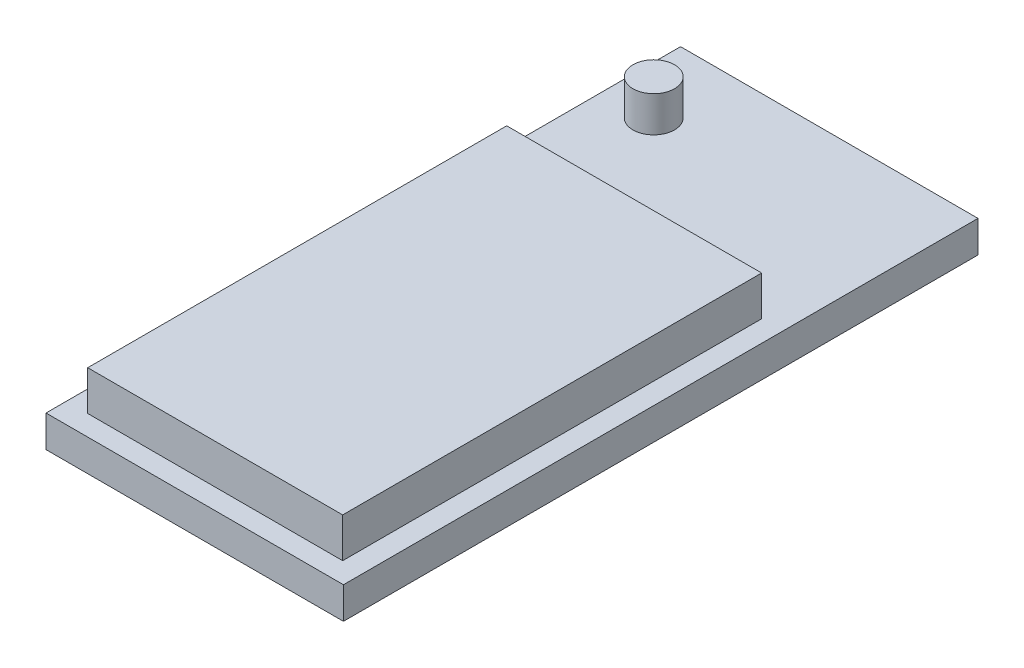
ISO-10303-21;
HEADER;
FILE_DESCRIPTION(('STEP AP214'),'2;1');
FILE_NAME('part.step','',(''),(''),'','','');
FILE_SCHEMA(('AUTOMOTIVE_DESIGN { 1 0 10303 214 1 1 1 1 }'));
ENDSEC;
DATA;
#1=APPLICATION_CONTEXT('core data for automotive mechanical design processes');
#2=APPLICATION_PROTOCOL_DEFINITION('international standard','automotive_design',2000,#1);
#3=PRODUCT_CONTEXT('',#1,'mechanical');
#4=PRODUCT('Part','Part','',(#3));
#5=PRODUCT_RELATED_PRODUCT_CATEGORY('part','',(#4));
#6=PRODUCT_DEFINITION_FORMATION('','',#4);
#7=PRODUCT_DEFINITION_CONTEXT('part definition',#1,'design');
#8=PRODUCT_DEFINITION('design','',#6,#7);
#9=PRODUCT_DEFINITION_SHAPE('','',#8);
#10=(LENGTH_UNIT() NAMED_UNIT(*) SI_UNIT(.MILLI.,.METRE.));
#11=(NAMED_UNIT(*) PLANE_ANGLE_UNIT() SI_UNIT($,.RADIAN.));
#12=(NAMED_UNIT(*) SI_UNIT($,.STERADIAN.) SOLID_ANGLE_UNIT());
#13=UNCERTAINTY_MEASURE_WITH_UNIT(LENGTH_MEASURE(1.E-05),#10,'distance_accuracy_value','');
#14=(GEOMETRIC_REPRESENTATION_CONTEXT(3) GLOBAL_UNCERTAINTY_ASSIGNED_CONTEXT((#13)) GLOBAL_UNIT_ASSIGNED_CONTEXT((#10,
#11,#12)) REPRESENTATION_CONTEXT('',''));
#15=CARTESIAN_POINT('',(0.,0.,0.));
#16=DIRECTION('',(0.,0.,1.));
#17=DIRECTION('',(1.,0.,0.));
#18=AXIS2_PLACEMENT_3D('',#15,#16,#17);
#19=CARTESIAN_POINT('',(0.,1.6,0.));
#20=DIRECTION('',(0.,1.,0.));
#21=DIRECTION('',(0.,0.,1.));
#22=AXIS2_PLACEMENT_3D('',#19,#20,#21);
#23=PLANE('',#22);
#24=DIRECTION('',(-1.,0.,0.));
#25=VECTOR('',#24,1.);
#26=CARTESIAN_POINT('',(6.43061488700591,1.6,-6.15881063183125));
#27=LINE('',#26,#25);
#28=CARTESIAN_POINT('',(6.43061488700591,1.6,-6.15881063183125));
#29=VERTEX_POINT('',#28);
#30=CARTESIAN_POINT('',(-6.42646424221845,1.6,-6.15881063183125));
#31=VERTEX_POINT('',#30);
#32=EDGE_CURVE('E213',#29,#31,#27,.T.);
#33=ORIENTED_EDGE('',*,*,#32,.F.);
#34=DIRECTION('',(0.,0.,-1.));
#35=VECTOR('',#34,1.);
#36=CARTESIAN_POINT('',(6.43061488700591,1.6,14.9699557693416));
#37=LINE('',#36,#35);
#38=CARTESIAN_POINT('',(6.43061488700591,1.6,14.9699557693416));
#39=VERTEX_POINT('',#38);
#40=EDGE_CURVE('E132',#39,#29,#37,.T.);
#41=ORIENTED_EDGE('',*,*,#40,.F.);
#42=DIRECTION('',(1.,0.,0.));
#43=VECTOR('',#42,1.);
#44=CARTESIAN_POINT('',(6.43061488700591,1.6,14.9699557693416));
#45=LINE('',#44,#43);
#46=CARTESIAN_POINT('',(-6.42646424221845,1.6,14.9699557693416));
#47=VERTEX_POINT('',#46);
#48=EDGE_CURVE('E128',#47,#39,#45,.T.);
#49=ORIENTED_EDGE('',*,*,#48,.F.);
#50=DIRECTION('',(0.,0.,1.));
#51=VECTOR('',#50,1.);
#52=CARTESIAN_POINT('',(-6.42646424221845,1.6,14.9699557693416));
#53=LINE('',#52,#51);
#54=EDGE_CURVE('E222',#31,#47,#53,.T.);
#55=ORIENTED_EDGE('',*,*,#54,.F.);
#56=EDGE_LOOP('',(#33,#41,#49,#55));
#57=FACE_BOUND('',#56,.T.);
#58=DIRECTION('',(0.,0.,1.));
#59=VECTOR('',#58,1.);
#60=CARTESIAN_POINT('',(-7.5,1.6,-16.));
#61=LINE('',#60,#59);
#62=CARTESIAN_POINT('',(-7.5,1.6,-16.));
#63=VERTEX_POINT('',#62);
#64=CARTESIAN_POINT('',(-7.5,1.6,16.));
#65=VERTEX_POINT('',#64);
#66=EDGE_CURVE('E142',#63,#65,#61,.T.);
#67=ORIENTED_EDGE('',*,*,#66,.T.);
#68=DIRECTION('',(1.,0.,0.));
#69=VECTOR('',#68,1.);
#70=CARTESIAN_POINT('',(-7.5,1.6,16.));
#71=LINE('',#70,#69);
#72=CARTESIAN_POINT('',(7.50000000000001,1.6,16.));
#73=VERTEX_POINT('',#72);
#74=EDGE_CURVE('E87',#65,#73,#71,.T.);
#75=ORIENTED_EDGE('',*,*,#74,.T.);
#76=DIRECTION('',(0.,0.,-1.));
#77=VECTOR('',#76,1.);
#78=CARTESIAN_POINT('',(7.5,1.6,-16.));
#79=LINE('',#78,#77);
#80=CARTESIAN_POINT('',(7.5,1.6,-16.));
#81=VERTEX_POINT('',#80);
#82=EDGE_CURVE('E145',#73,#81,#79,.T.);
#83=ORIENTED_EDGE('',*,*,#82,.T.);
#84=DIRECTION('',(-1.,0.,0.));
#85=VECTOR('',#84,1.);
#86=CARTESIAN_POINT('',(-7.5,1.6,-16.));
#87=LINE('',#86,#85);
#88=EDGE_CURVE('E59',#81,#63,#87,.T.);
#89=ORIENTED_EDGE('',*,*,#88,.T.);
#90=EDGE_LOOP('',(#67,#75,#83,#89));
#91=FACE_BOUND('',#90,.T.);
#92=CARTESIAN_POINT('',(-5.06278392747851,1.6,-12.2099844827937));
#93=DIRECTION('',(0.,1.,0.));
#94=DIRECTION('',(0.,0.,1.));
#95=AXIS2_PLACEMENT_3D('',#92,#93,#94);
#96=CIRCLE('',#95,1.04874698155847);
#97=CARTESIAN_POINT('',(-5.06278392747851,1.6,-11.1612375012352));
#98=VERTEX_POINT('',#97);
#99=EDGE_CURVE('E211',#98,#98,#96,.T.);
#100=ORIENTED_EDGE('',*,*,#99,.F.);
#101=EDGE_LOOP('',(#100));
#102=FACE_BOUND('',#101,.T.);
#103=ADVANCED_FACE('F35',(#57,#91,#102),#23,.T.);
#104=CARTESIAN_POINT('',(-7.5,1.6,-16.));
#105=DIRECTION('',(1.,0.,0.));
#106=DIRECTION('',(0.,0.,-1.));
#107=AXIS2_PLACEMENT_3D('',#104,#105,#106);
#108=PLANE('',#107);
#109=DIRECTION('',(0.,0.,1.));
#110=VECTOR('',#109,1.);
#111=CARTESIAN_POINT('',(-7.5,0.,-16.));
#112=LINE('',#111,#110);
#113=CARTESIAN_POINT('',(-7.5,0.,-16.));
#114=VERTEX_POINT('',#113);
#115=CARTESIAN_POINT('',(-7.5,0.,16.));
#116=VERTEX_POINT('',#115);
#117=EDGE_CURVE('E134',#114,#116,#112,.T.);
#118=ORIENTED_EDGE('',*,*,#117,.T.);
#119=DIRECTION('',(0.,-1.,0.));
#120=VECTOR('',#119,1.);
#121=CARTESIAN_POINT('',(-7.5,1.6,16.));
#122=LINE('',#121,#120);
#123=EDGE_CURVE('E11',#65,#116,#122,.T.);
#124=ORIENTED_EDGE('',*,*,#123,.F.);
#125=ORIENTED_EDGE('',*,*,#66,.F.);
#126=DIRECTION('',(0.,-1.,0.));
#127=VECTOR('',#126,1.);
#128=CARTESIAN_POINT('',(-7.5,1.6,-16.));
#129=LINE('',#128,#127);
#130=EDGE_CURVE('E147',#63,#114,#129,.T.);
#131=ORIENTED_EDGE('',*,*,#130,.T.);
#132=EDGE_LOOP('',(#118,#124,#125,#131));
#133=FACE_BOUND('',#132,.T.);
#134=ADVANCED_FACE('F37',(#133),#108,.F.);
#135=CARTESIAN_POINT('',(-7.5,1.6,16.));
#136=DIRECTION('',(0.,0.,-1.));
#137=DIRECTION('',(-1.,0.,0.));
#138=AXIS2_PLACEMENT_3D('',#135,#136,#137);
#139=PLANE('',#138);
#140=DIRECTION('',(1.,0.,0.));
#141=VECTOR('',#140,1.);
#142=CARTESIAN_POINT('',(-7.5,0.,16.));
#143=LINE('',#142,#141);
#144=CARTESIAN_POINT('',(7.50000000000001,0.,16.));
#145=VERTEX_POINT('',#144);
#146=EDGE_CURVE('E137',#116,#145,#143,.T.);
#147=ORIENTED_EDGE('',*,*,#146,.T.);
#148=DIRECTION('',(0.,-1.,0.));
#149=VECTOR('',#148,1.);
#150=CARTESIAN_POINT('',(7.50000000000001,1.6,16.));
#151=LINE('',#150,#149);
#152=EDGE_CURVE('E43',#73,#145,#151,.T.);
#153=ORIENTED_EDGE('',*,*,#152,.F.);
#154=ORIENTED_EDGE('',*,*,#74,.F.);
#155=ORIENTED_EDGE('',*,*,#123,.T.);
#156=EDGE_LOOP('',(#147,#153,#154,#155));
#157=FACE_BOUND('',#156,.T.);
#158=ADVANCED_FACE('F175',(#157),#139,.F.);
#159=CARTESIAN_POINT('',(7.5,1.6,-16.));
#160=DIRECTION('',(-1.,0.,0.));
#161=DIRECTION('',(0.,0.,1.));
#162=AXIS2_PLACEMENT_3D('',#159,#160,#161);
#163=PLANE('',#162);
#164=DIRECTION('',(0.,0.,-1.));
#165=VECTOR('',#164,1.);
#166=CARTESIAN_POINT('',(7.5,0.,-16.));
#167=LINE('',#166,#165);
#168=CARTESIAN_POINT('',(7.5,0.,-16.));
#169=VERTEX_POINT('',#168);
#170=EDGE_CURVE('E150',#145,#169,#167,.T.);
#171=ORIENTED_EDGE('',*,*,#170,.T.);
#172=DIRECTION('',(0.,-1.,0.));
#173=VECTOR('',#172,1.);
#174=CARTESIAN_POINT('',(7.5,1.6,-16.));
#175=LINE('',#174,#173);
#176=EDGE_CURVE('E154',#81,#169,#175,.T.);
#177=ORIENTED_EDGE('',*,*,#176,.F.);
#178=ORIENTED_EDGE('',*,*,#82,.F.);
#179=ORIENTED_EDGE('',*,*,#152,.T.);
#180=EDGE_LOOP('',(#171,#177,#178,#179));
#181=FACE_BOUND('',#180,.T.);
#182=ADVANCED_FACE('F159',(#181),#163,.F.);
#183=CARTESIAN_POINT('',(-7.5,1.6,-16.));
#184=DIRECTION('',(0.,0.,1.));
#185=DIRECTION('',(1.,0.,0.));
#186=AXIS2_PLACEMENT_3D('',#183,#184,#185);
#187=PLANE('',#186);
#188=DIRECTION('',(-1.,0.,0.));
#189=VECTOR('',#188,1.);
#190=CARTESIAN_POINT('',(-7.5,0.,-16.));
#191=LINE('',#190,#189);
#192=EDGE_CURVE('E80',#169,#114,#191,.T.);
#193=ORIENTED_EDGE('',*,*,#192,.T.);
#194=ORIENTED_EDGE('',*,*,#130,.F.);
#195=ORIENTED_EDGE('',*,*,#88,.F.);
#196=ORIENTED_EDGE('',*,*,#176,.T.);
#197=EDGE_LOOP('',(#193,#194,#195,#196));
#198=FACE_BOUND('',#197,.T.);
#199=ADVANCED_FACE('F167',(#198),#187,.F.);
#200=CARTESIAN_POINT('',(0.,0.,0.));
#201=DIRECTION('',(0.,1.,0.));
#202=DIRECTION('',(0.,0.,1.));
#203=AXIS2_PLACEMENT_3D('',#200,#201,#202);
#204=PLANE('',#203);
#205=ORIENTED_EDGE('',*,*,#117,.F.);
#206=ORIENTED_EDGE('',*,*,#192,.F.);
#207=ORIENTED_EDGE('',*,*,#170,.F.);
#208=ORIENTED_EDGE('',*,*,#146,.F.);
#209=EDGE_LOOP('',(#205,#206,#207,#208));
#210=FACE_BOUND('',#209,.T.);
#211=ADVANCED_FACE('F163',(#210),#204,.F.);
#212=CARTESIAN_POINT('',(6.43061488700591,3.6,14.9699557693416));
#213=DIRECTION('',(-1.,0.,0.));
#214=DIRECTION('',(0.,0.,1.));
#215=AXIS2_PLACEMENT_3D('',#212,#213,#214);
#216=PLANE('',#215);
#217=ORIENTED_EDGE('',*,*,#40,.T.);
#218=DIRECTION('',(0.,-1.,0.));
#219=VECTOR('',#218,1.);
#220=CARTESIAN_POINT('',(6.43061488700591,3.6,-6.15881063183125));
#221=LINE('',#220,#219);
#222=CARTESIAN_POINT('',(6.43061488700591,3.6,-6.15881063183125));
#223=VERTEX_POINT('',#222);
#224=EDGE_CURVE('E113',#223,#29,#221,.T.);
#225=ORIENTED_EDGE('',*,*,#224,.F.);
#226=DIRECTION('',(0.,0.,-1.));
#227=VECTOR('',#226,1.);
#228=CARTESIAN_POINT('',(6.43061488700591,3.6,14.9699557693416));
#229=LINE('',#228,#227);
#230=CARTESIAN_POINT('',(6.43061488700591,3.6,14.9699557693416));
#231=VERTEX_POINT('',#230);
#232=EDGE_CURVE('E120',#231,#223,#229,.T.);
#233=ORIENTED_EDGE('',*,*,#232,.F.);
#234=DIRECTION('',(0.,-1.,0.));
#235=VECTOR('',#234,1.);
#236=CARTESIAN_POINT('',(6.43061488700591,3.6,14.9699557693416));
#237=LINE('',#236,#235);
#238=EDGE_CURVE('E219',#231,#39,#237,.T.);
#239=ORIENTED_EDGE('',*,*,#238,.T.);
#240=EDGE_LOOP('',(#217,#225,#233,#239));
#241=FACE_BOUND('',#240,.T.);
#242=ADVANCED_FACE('F130',(#241),#216,.F.);
#243=CARTESIAN_POINT('',(6.43061488700591,3.6,-6.15881063183125));
#244=DIRECTION('',(0.,0.,1.));
#245=DIRECTION('',(1.,0.,0.));
#246=AXIS2_PLACEMENT_3D('',#243,#244,#245);
#247=PLANE('',#246);
#248=ORIENTED_EDGE('',*,*,#32,.T.);
#249=DIRECTION('',(0.,-1.,0.));
#250=VECTOR('',#249,1.);
#251=CARTESIAN_POINT('',(-6.42646424221845,3.6,-6.15881063183125));
#252=LINE('',#251,#250);
#253=CARTESIAN_POINT('',(-6.42646424221845,3.6,-6.15881063183125));
#254=VERTEX_POINT('',#253);
#255=EDGE_CURVE('E116',#254,#31,#252,.T.);
#256=ORIENTED_EDGE('',*,*,#255,.F.);
#257=DIRECTION('',(-1.,0.,0.));
#258=VECTOR('',#257,1.);
#259=CARTESIAN_POINT('',(6.43061488700591,3.6,-6.15881063183125));
#260=LINE('',#259,#258);
#261=EDGE_CURVE('E109',#223,#254,#260,.T.);
#262=ORIENTED_EDGE('',*,*,#261,.F.);
#263=ORIENTED_EDGE('',*,*,#224,.T.);
#264=EDGE_LOOP('',(#248,#256,#262,#263));
#265=FACE_BOUND('',#264,.T.);
#266=ADVANCED_FACE('F111',(#265),#247,.F.);
#267=CARTESIAN_POINT('',(-6.42646424221845,3.6,14.9699557693416));
#268=DIRECTION('',(1.,0.,0.));
#269=DIRECTION('',(0.,0.,-1.));
#270=AXIS2_PLACEMENT_3D('',#267,#268,#269);
#271=PLANE('',#270);
#272=ORIENTED_EDGE('',*,*,#54,.T.);
#273=DIRECTION('',(0.,-1.,0.));
#274=VECTOR('',#273,1.);
#275=CARTESIAN_POINT('',(-6.42646424221845,3.6,14.9699557693416));
#276=LINE('',#275,#274);
#277=CARTESIAN_POINT('',(-6.42646424221845,3.6,14.9699557693416));
#278=VERTEX_POINT('',#277);
#279=EDGE_CURVE('E50',#278,#47,#276,.T.);
#280=ORIENTED_EDGE('',*,*,#279,.F.);
#281=DIRECTION('',(0.,0.,1.));
#282=VECTOR('',#281,1.);
#283=CARTESIAN_POINT('',(-6.42646424221845,3.6,14.9699557693416));
#284=LINE('',#283,#282);
#285=EDGE_CURVE('E119',#254,#278,#284,.T.);
#286=ORIENTED_EDGE('',*,*,#285,.F.);
#287=ORIENTED_EDGE('',*,*,#255,.T.);
#288=EDGE_LOOP('',(#272,#280,#286,#287));
#289=FACE_BOUND('',#288,.T.);
#290=ADVANCED_FACE('F190',(#289),#271,.F.);
#291=CARTESIAN_POINT('',(6.43061488700591,3.6,14.9699557693416));
#292=DIRECTION('',(0.,0.,-1.));
#293=DIRECTION('',(-1.,0.,0.));
#294=AXIS2_PLACEMENT_3D('',#291,#292,#293);
#295=PLANE('',#294);
#296=ORIENTED_EDGE('',*,*,#48,.T.);
#297=ORIENTED_EDGE('',*,*,#238,.F.);
#298=DIRECTION('',(1.,0.,0.));
#299=VECTOR('',#298,1.);
#300=CARTESIAN_POINT('',(6.43061488700591,3.6,14.9699557693416));
#301=LINE('',#300,#299);
#302=EDGE_CURVE('E124',#278,#231,#301,.T.);
#303=ORIENTED_EDGE('',*,*,#302,.F.);
#304=ORIENTED_EDGE('',*,*,#279,.T.);
#305=EDGE_LOOP('',(#296,#297,#303,#304));
#306=FACE_BOUND('',#305,.T.);
#307=ADVANCED_FACE('F193',(#306),#295,.F.);
#308=CARTESIAN_POINT('',(0.,3.6,0.));
#309=DIRECTION('',(0.,1.,0.));
#310=DIRECTION('',(0.,0.,1.));
#311=AXIS2_PLACEMENT_3D('',#308,#309,#310);
#312=PLANE('',#311);
#313=ORIENTED_EDGE('',*,*,#232,.T.);
#314=ORIENTED_EDGE('',*,*,#261,.T.);
#315=ORIENTED_EDGE('',*,*,#285,.T.);
#316=ORIENTED_EDGE('',*,*,#302,.T.);
#317=EDGE_LOOP('',(#313,#314,#315,#316));
#318=FACE_BOUND('',#317,.T.);
#319=ADVANCED_FACE('F123',(#318),#312,.T.);
#320=CARTESIAN_POINT('',(-5.06278392747851,3.4,-12.2099844827937));
#321=DIRECTION('',(0.,-1.,0.));
#322=DIRECTION('',(0.,0.,-1.));
#323=AXIS2_PLACEMENT_3D('',#320,#321,#322);
#324=CYLINDRICAL_SURFACE('',#323,1.04874698155847);
#325=CARTESIAN_POINT('',(-5.06278392747851,3.4,-12.2099844827937));
#326=DIRECTION('',(0.,1.,0.));
#327=DIRECTION('',(0.,0.,1.));
#328=AXIS2_PLACEMENT_3D('',#325,#326,#327);
#329=CIRCLE('',#328,1.04874698155847);
#330=CARTESIAN_POINT('',(-5.06278392747851,3.4,-11.1612375012352));
#331=VERTEX_POINT('',#330);
#332=EDGE_CURVE('E210',#331,#331,#329,.T.);
#333=ORIENTED_EDGE('',*,*,#332,.F.);
#334=EDGE_LOOP('',(#333));
#335=FACE_BOUND('',#334,.T.);
#336=ORIENTED_EDGE('',*,*,#99,.T.);
#337=EDGE_LOOP('',(#336));
#338=FACE_BOUND('',#337,.T.);
#339=ADVANCED_FACE('F199',(#335,#338),#324,.T.);
#340=CARTESIAN_POINT('',(-5.06278392747851,3.4,-12.2099844827937));
#341=DIRECTION('',(0.,1.,0.));
#342=DIRECTION('',(0.,0.,1.));
#343=AXIS2_PLACEMENT_3D('',#340,#341,#342);
#344=PLANE('',#343);
#345=ORIENTED_EDGE('',*,*,#332,.T.);
#346=EDGE_LOOP('',(#345));
#347=FACE_BOUND('',#346,.T.);
#348=ADVANCED_FACE('F202',(#347),#344,.T.);
#349=CLOSED_SHELL('',(#103,#134,#158,#182,#199,#211,#242,#266,#290,#307,#319,#339,#348));
#350=MANIFOLD_SOLID_BREP('B2',#349);
#351=ADVANCED_BREP_SHAPE_REPRESENTATION('',(#18,#350),#14);
#352=SHAPE_DEFINITION_REPRESENTATION(#9,#351);
ENDSEC;
END-ISO-10303-21;
